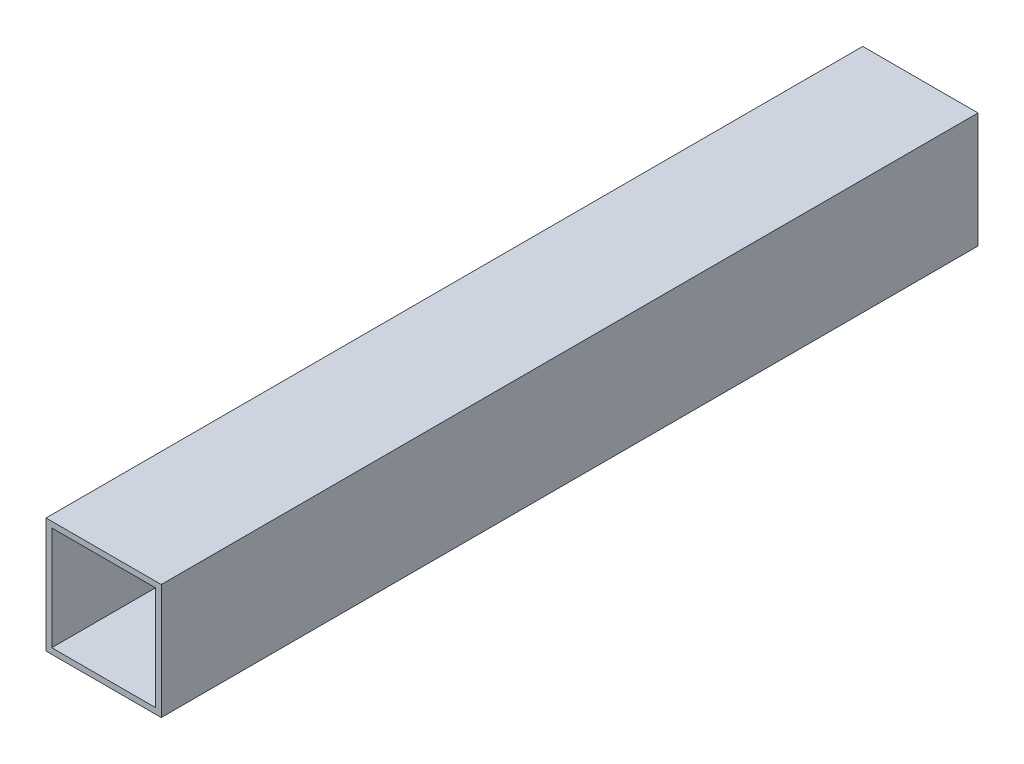
ISO-10303-21;
HEADER;
FILE_DESCRIPTION(('STEP AP214'),'2;1');
FILE_NAME('part.step','',(''),(''),'','','');
FILE_SCHEMA(('AUTOMOTIVE_DESIGN { 1 0 10303 214 1 1 1 1 }'));
ENDSEC;
DATA;
#1=APPLICATION_CONTEXT('core data for automotive mechanical design processes');
#2=APPLICATION_PROTOCOL_DEFINITION('international standard','automotive_design',2000,#1);
#3=PRODUCT_CONTEXT('',#1,'mechanical');
#4=PRODUCT('Part','Part','',(#3));
#5=PRODUCT_RELATED_PRODUCT_CATEGORY('part','',(#4));
#6=PRODUCT_DEFINITION_FORMATION('','',#4);
#7=PRODUCT_DEFINITION_CONTEXT('part definition',#1,'design');
#8=PRODUCT_DEFINITION('design','',#6,#7);
#9=PRODUCT_DEFINITION_SHAPE('','',#8);
#10=(LENGTH_UNIT() NAMED_UNIT(*) SI_UNIT(.MILLI.,.METRE.));
#11=(NAMED_UNIT(*) PLANE_ANGLE_UNIT() SI_UNIT($,.RADIAN.));
#12=(NAMED_UNIT(*) SI_UNIT($,.STERADIAN.) SOLID_ANGLE_UNIT());
#13=UNCERTAINTY_MEASURE_WITH_UNIT(LENGTH_MEASURE(1.E-05),#10,'distance_accuracy_value','');
#14=(GEOMETRIC_REPRESENTATION_CONTEXT(3) GLOBAL_UNCERTAINTY_ASSIGNED_CONTEXT((#13)) GLOBAL_UNIT_ASSIGNED_CONTEXT((#10,
#11,#12)) REPRESENTATION_CONTEXT('',''));
#15=CARTESIAN_POINT('',(0.,0.,0.));
#16=DIRECTION('',(0.,0.,1.));
#17=DIRECTION('',(1.,0.,0.));
#18=AXIS2_PLACEMENT_3D('',#15,#16,#17);
#19=CARTESIAN_POINT('',(0.,0.,225.));
#20=DIRECTION('',(0.,0.,1.));
#21=DIRECTION('',(1.,0.,0.));
#22=AXIS2_PLACEMENT_3D('',#19,#20,#21);
#23=PLANE('',#22);
#24=DIRECTION('',(0.,1.,0.));
#25=VECTOR('',#24,1.);
#26=CARTESIAN_POINT('',(15.875,15.875,225.));
#27=LINE('',#26,#25);
#28=CARTESIAN_POINT('',(15.875,-15.875,225.));
#29=VERTEX_POINT('',#28);
#30=CARTESIAN_POINT('',(15.875,15.875,225.));
#31=VERTEX_POINT('',#30);
#32=EDGE_CURVE('E134',#29,#31,#27,.T.);
#33=ORIENTED_EDGE('',*,*,#32,.T.);
#34=DIRECTION('',(-1.,0.,0.));
#35=VECTOR('',#34,1.);
#36=CARTESIAN_POINT('',(-15.875,15.875,225.));
#37=LINE('',#36,#35);
#38=CARTESIAN_POINT('',(-15.875,15.875,225.));
#39=VERTEX_POINT('',#38);
#40=EDGE_CURVE('E137',#31,#39,#37,.T.);
#41=ORIENTED_EDGE('',*,*,#40,.T.);
#42=DIRECTION('',(0.,-1.,0.));
#43=VECTOR('',#42,1.);
#44=CARTESIAN_POINT('',(-15.875,15.875,225.));
#45=LINE('',#44,#43);
#46=CARTESIAN_POINT('',(-15.875,-15.875,225.));
#47=VERTEX_POINT('',#46);
#48=EDGE_CURVE('E140',#39,#47,#45,.T.);
#49=ORIENTED_EDGE('',*,*,#48,.T.);
#50=DIRECTION('',(1.,0.,0.));
#51=VECTOR('',#50,1.);
#52=CARTESIAN_POINT('',(-15.875,-15.875,225.));
#53=LINE('',#52,#51);
#54=EDGE_CURVE('E142',#47,#29,#53,.T.);
#55=ORIENTED_EDGE('',*,*,#54,.T.);
#56=EDGE_LOOP('',(#33,#41,#49,#55));
#57=FACE_BOUND('',#56,.T.);
#58=DIRECTION('',(-1.,0.,0.));
#59=VECTOR('',#58,1.);
#60=CARTESIAN_POINT('',(-14.2875,14.2875,225.));
#61=LINE('',#60,#59);
#62=CARTESIAN_POINT('',(14.2875,14.2875,225.));
#63=VERTEX_POINT('',#62);
#64=CARTESIAN_POINT('',(-14.2875,14.2875,225.));
#65=VERTEX_POINT('',#64);
#66=EDGE_CURVE('E106',#63,#65,#61,.T.);
#67=ORIENTED_EDGE('',*,*,#66,.F.);
#68=DIRECTION('',(0.,1.,0.));
#69=VECTOR('',#68,1.);
#70=CARTESIAN_POINT('',(14.2875,14.2875,225.));
#71=LINE('',#70,#69);
#72=CARTESIAN_POINT('',(14.2875,-14.2875,225.));
#73=VERTEX_POINT('',#72);
#74=EDGE_CURVE('E98',#73,#63,#71,.T.);
#75=ORIENTED_EDGE('',*,*,#74,.F.);
#76=DIRECTION('',(1.,0.,0.));
#77=VECTOR('',#76,1.);
#78=CARTESIAN_POINT('',(-14.2875,-14.2875,225.));
#79=LINE('',#78,#77);
#80=CARTESIAN_POINT('',(-14.2875,-14.2875,225.));
#81=VERTEX_POINT('',#80);
#82=EDGE_CURVE('E120',#81,#73,#79,.T.);
#83=ORIENTED_EDGE('',*,*,#82,.F.);
#84=DIRECTION('',(0.,-1.,0.));
#85=VECTOR('',#84,1.);
#86=CARTESIAN_POINT('',(-14.2875,14.2875,225.));
#87=LINE('',#86,#85);
#88=EDGE_CURVE('E118',#65,#81,#87,.T.);
#89=ORIENTED_EDGE('',*,*,#88,.F.);
#90=EDGE_LOOP('',(#67,#75,#83,#89));
#91=FACE_BOUND('',#90,.T.);
#92=ADVANCED_FACE('F33',(#57,#91),#23,.T.);
#93=CARTESIAN_POINT('',(0.,0.,0.));
#94=DIRECTION('',(0.,0.,1.));
#95=DIRECTION('',(1.,0.,0.));
#96=AXIS2_PLACEMENT_3D('',#93,#94,#95);
#97=PLANE('',#96);
#98=DIRECTION('',(0.,1.,0.));
#99=VECTOR('',#98,1.);
#100=CARTESIAN_POINT('',(15.875,15.875,0.));
#101=LINE('',#100,#99);
#102=CARTESIAN_POINT('',(15.875,-15.875,0.));
#103=VERTEX_POINT('',#102);
#104=CARTESIAN_POINT('',(15.875,15.875,0.));
#105=VERTEX_POINT('',#104);
#106=EDGE_CURVE('E114',#103,#105,#101,.T.);
#107=ORIENTED_EDGE('',*,*,#106,.F.);
#108=DIRECTION('',(1.,0.,0.));
#109=VECTOR('',#108,1.);
#110=CARTESIAN_POINT('',(-15.875,-15.875,0.));
#111=LINE('',#110,#109);
#112=CARTESIAN_POINT('',(-15.875,-15.875,0.));
#113=VERTEX_POINT('',#112);
#114=EDGE_CURVE('E138',#113,#103,#111,.T.);
#115=ORIENTED_EDGE('',*,*,#114,.F.);
#116=DIRECTION('',(0.,-1.,0.));
#117=VECTOR('',#116,1.);
#118=CARTESIAN_POINT('',(-15.875,15.875,0.));
#119=LINE('',#118,#117);
#120=CARTESIAN_POINT('',(-15.875,15.875,0.));
#121=VERTEX_POINT('',#120);
#122=EDGE_CURVE('E149',#121,#113,#119,.T.);
#123=ORIENTED_EDGE('',*,*,#122,.F.);
#124=DIRECTION('',(-1.,0.,0.));
#125=VECTOR('',#124,1.);
#126=CARTESIAN_POINT('',(-15.875,15.875,0.));
#127=LINE('',#126,#125);
#128=EDGE_CURVE('E147',#105,#121,#127,.T.);
#129=ORIENTED_EDGE('',*,*,#128,.F.);
#130=EDGE_LOOP('',(#107,#115,#123,#129));
#131=FACE_BOUND('',#130,.T.);
#132=DIRECTION('',(0.,1.,0.));
#133=VECTOR('',#132,1.);
#134=CARTESIAN_POINT('',(14.2875,14.2875,0.));
#135=LINE('',#134,#133);
#136=CARTESIAN_POINT('',(14.2875,-14.2875,0.));
#137=VERTEX_POINT('',#136);
#138=CARTESIAN_POINT('',(14.2875,14.2875,0.));
#139=VERTEX_POINT('',#138);
#140=EDGE_CURVE('E56',#137,#139,#135,.T.);
#141=ORIENTED_EDGE('',*,*,#140,.T.);
#142=DIRECTION('',(-1.,0.,0.));
#143=VECTOR('',#142,1.);
#144=CARTESIAN_POINT('',(-14.2875,14.2875,0.));
#145=LINE('',#144,#143);
#146=CARTESIAN_POINT('',(-14.2875,14.2875,0.));
#147=VERTEX_POINT('',#146);
#148=EDGE_CURVE('E113',#139,#147,#145,.T.);
#149=ORIENTED_EDGE('',*,*,#148,.T.);
#150=DIRECTION('',(0.,-1.,0.));
#151=VECTOR('',#150,1.);
#152=CARTESIAN_POINT('',(-14.2875,14.2875,0.));
#153=LINE('',#152,#151);
#154=CARTESIAN_POINT('',(-14.2875,-14.2875,0.));
#155=VERTEX_POINT('',#154);
#156=EDGE_CURVE('E126',#147,#155,#153,.T.);
#157=ORIENTED_EDGE('',*,*,#156,.T.);
#158=DIRECTION('',(1.,0.,0.));
#159=VECTOR('',#158,1.);
#160=CARTESIAN_POINT('',(-14.2875,-14.2875,0.));
#161=LINE('',#160,#159);
#162=EDGE_CURVE('E107',#155,#137,#161,.T.);
#163=ORIENTED_EDGE('',*,*,#162,.T.);
#164=EDGE_LOOP('',(#141,#149,#157,#163));
#165=FACE_BOUND('',#164,.T.);
#166=ADVANCED_FACE('F167',(#131,#165),#97,.F.);
#167=CARTESIAN_POINT('',(15.875,15.875,225.));
#168=DIRECTION('',(-1.,0.,0.));
#169=DIRECTION('',(0.,-1.,0.));
#170=AXIS2_PLACEMENT_3D('',#167,#168,#169);
#171=PLANE('',#170);
#172=ORIENTED_EDGE('',*,*,#106,.T.);
#173=DIRECTION('',(0.,0.,-1.));
#174=VECTOR('',#173,1.);
#175=CARTESIAN_POINT('',(15.875,15.875,225.));
#176=LINE('',#175,#174);
#177=EDGE_CURVE('E11',#31,#105,#176,.T.);
#178=ORIENTED_EDGE('',*,*,#177,.F.);
#179=ORIENTED_EDGE('',*,*,#32,.F.);
#180=DIRECTION('',(0.,0.,-1.));
#181=VECTOR('',#180,1.);
#182=CARTESIAN_POINT('',(15.875,-15.875,225.));
#183=LINE('',#182,#181);
#184=EDGE_CURVE('E144',#29,#103,#183,.T.);
#185=ORIENTED_EDGE('',*,*,#184,.T.);
#186=EDGE_LOOP('',(#172,#178,#179,#185));
#187=FACE_BOUND('',#186,.T.);
#188=ADVANCED_FACE('F35',(#187),#171,.F.);
#189=CARTESIAN_POINT('',(-15.875,15.875,225.));
#190=DIRECTION('',(0.,-1.,0.));
#191=DIRECTION('',(0.,0.,-1.));
#192=AXIS2_PLACEMENT_3D('',#189,#190,#191);
#193=PLANE('',#192);
#194=ORIENTED_EDGE('',*,*,#128,.T.);
#195=DIRECTION('',(0.,0.,-1.));
#196=VECTOR('',#195,1.);
#197=CARTESIAN_POINT('',(-15.875,15.875,225.));
#198=LINE('',#197,#196);
#199=EDGE_CURVE('E41',#39,#121,#198,.T.);
#200=ORIENTED_EDGE('',*,*,#199,.F.);
#201=ORIENTED_EDGE('',*,*,#40,.F.);
#202=ORIENTED_EDGE('',*,*,#177,.T.);
#203=EDGE_LOOP('',(#194,#200,#201,#202));
#204=FACE_BOUND('',#203,.T.);
#205=ADVANCED_FACE('F177',(#204),#193,.F.);
#206=CARTESIAN_POINT('',(-15.875,15.875,225.));
#207=DIRECTION('',(1.,0.,0.));
#208=DIRECTION('',(0.,0.,-1.));
#209=AXIS2_PLACEMENT_3D('',#206,#207,#208);
#210=PLANE('',#209);
#211=ORIENTED_EDGE('',*,*,#122,.T.);
#212=DIRECTION('',(0.,0.,-1.));
#213=VECTOR('',#212,1.);
#214=CARTESIAN_POINT('',(-15.875,-15.875,225.));
#215=LINE('',#214,#213);
#216=EDGE_CURVE('E154',#47,#113,#215,.T.);
#217=ORIENTED_EDGE('',*,*,#216,.F.);
#218=ORIENTED_EDGE('',*,*,#48,.F.);
#219=ORIENTED_EDGE('',*,*,#199,.T.);
#220=EDGE_LOOP('',(#211,#217,#218,#219));
#221=FACE_BOUND('',#220,.T.);
#222=ADVANCED_FACE('F161',(#221),#210,.F.);
#223=CARTESIAN_POINT('',(-15.875,-15.875,225.));
#224=DIRECTION('',(0.,1.,0.));
#225=DIRECTION('',(0.,0.,1.));
#226=AXIS2_PLACEMENT_3D('',#223,#224,#225);
#227=PLANE('',#226);
#228=ORIENTED_EDGE('',*,*,#114,.T.);
#229=ORIENTED_EDGE('',*,*,#184,.F.);
#230=ORIENTED_EDGE('',*,*,#54,.F.);
#231=ORIENTED_EDGE('',*,*,#216,.T.);
#232=EDGE_LOOP('',(#228,#229,#230,#231));
#233=FACE_BOUND('',#232,.T.);
#234=ADVANCED_FACE('F171',(#233),#227,.F.);
#235=CARTESIAN_POINT('',(14.2875,14.2875,225.));
#236=DIRECTION('',(-1.,0.,0.));
#237=DIRECTION('',(0.,0.,1.));
#238=AXIS2_PLACEMENT_3D('',#235,#236,#237);
#239=PLANE('',#238);
#240=ORIENTED_EDGE('',*,*,#140,.F.);
#241=DIRECTION('',(0.,0.,-1.));
#242=VECTOR('',#241,1.);
#243=CARTESIAN_POINT('',(14.2875,-14.2875,225.));
#244=LINE('',#243,#242);
#245=EDGE_CURVE('E102',#73,#137,#244,.T.);
#246=ORIENTED_EDGE('',*,*,#245,.F.);
#247=ORIENTED_EDGE('',*,*,#74,.T.);
#248=DIRECTION('',(0.,0.,-1.));
#249=VECTOR('',#248,1.);
#250=CARTESIAN_POINT('',(14.2875,14.2875,225.));
#251=LINE('',#250,#249);
#252=EDGE_CURVE('E101',#63,#139,#251,.T.);
#253=ORIENTED_EDGE('',*,*,#252,.T.);
#254=EDGE_LOOP('',(#240,#246,#247,#253));
#255=FACE_BOUND('',#254,.T.);
#256=ADVANCED_FACE('F100',(#255),#239,.T.);
#257=CARTESIAN_POINT('',(-14.2875,14.2875,225.));
#258=DIRECTION('',(0.,-1.,0.));
#259=DIRECTION('',(0.,0.,-1.));
#260=AXIS2_PLACEMENT_3D('',#257,#258,#259);
#261=PLANE('',#260);
#262=ORIENTED_EDGE('',*,*,#148,.F.);
#263=ORIENTED_EDGE('',*,*,#252,.F.);
#264=ORIENTED_EDGE('',*,*,#66,.T.);
#265=DIRECTION('',(0.,0.,-1.));
#266=VECTOR('',#265,1.);
#267=CARTESIAN_POINT('',(-14.2875,14.2875,225.));
#268=LINE('',#267,#266);
#269=EDGE_CURVE('E115',#65,#147,#268,.T.);
#270=ORIENTED_EDGE('',*,*,#269,.T.);
#271=EDGE_LOOP('',(#262,#263,#264,#270));
#272=FACE_BOUND('',#271,.T.);
#273=ADVANCED_FACE('F110',(#272),#261,.T.);
#274=CARTESIAN_POINT('',(-14.2875,14.2875,225.));
#275=DIRECTION('',(1.,0.,0.));
#276=DIRECTION('',(0.,0.,-1.));
#277=AXIS2_PLACEMENT_3D('',#274,#275,#276);
#278=PLANE('',#277);
#279=ORIENTED_EDGE('',*,*,#156,.F.);
#280=ORIENTED_EDGE('',*,*,#269,.F.);
#281=ORIENTED_EDGE('',*,*,#88,.T.);
#282=DIRECTION('',(0.,0.,-1.));
#283=VECTOR('',#282,1.);
#284=CARTESIAN_POINT('',(-14.2875,-14.2875,225.));
#285=LINE('',#284,#283);
#286=EDGE_CURVE('E48',#81,#155,#285,.T.);
#287=ORIENTED_EDGE('',*,*,#286,.T.);
#288=EDGE_LOOP('',(#279,#280,#281,#287));
#289=FACE_BOUND('',#288,.T.);
#290=ADVANCED_FACE('F200',(#289),#278,.T.);
#291=CARTESIAN_POINT('',(-14.2875,-14.2875,225.));
#292=DIRECTION('',(0.,1.,0.));
#293=DIRECTION('',(0.,0.,1.));
#294=AXIS2_PLACEMENT_3D('',#291,#292,#293);
#295=PLANE('',#294);
#296=ORIENTED_EDGE('',*,*,#162,.F.);
#297=ORIENTED_EDGE('',*,*,#286,.F.);
#298=ORIENTED_EDGE('',*,*,#82,.T.);
#299=ORIENTED_EDGE('',*,*,#245,.T.);
#300=EDGE_LOOP('',(#296,#297,#298,#299));
#301=FACE_BOUND('',#300,.T.);
#302=ADVANCED_FACE('F204',(#301),#295,.T.);
#303=CLOSED_SHELL('',(#92,#166,#188,#205,#222,#234,#256,#273,#290,#302));
#304=MANIFOLD_SOLID_BREP('B2',#303);
#305=ADVANCED_BREP_SHAPE_REPRESENTATION('',(#18,#304),#14);
#306=SHAPE_DEFINITION_REPRESENTATION(#9,#305);
ENDSEC;
END-ISO-10303-21;
